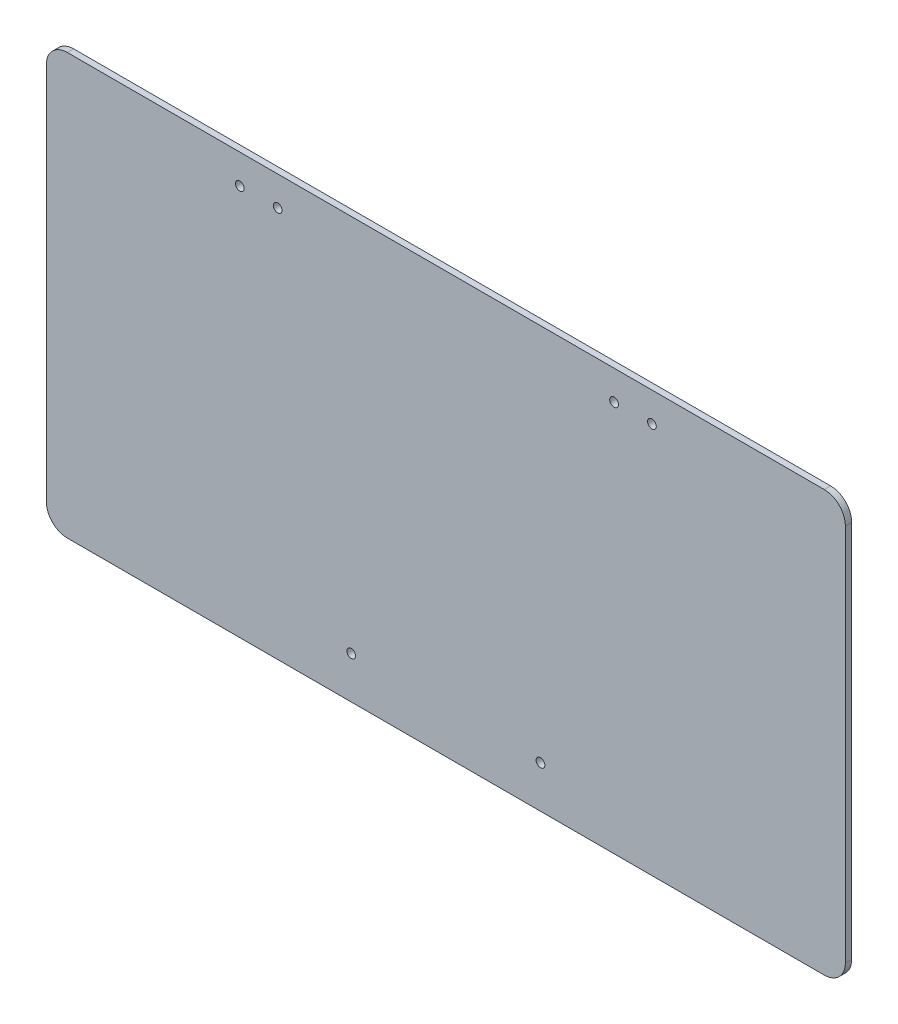
ISO-10303-21;
HEADER;
FILE_DESCRIPTION(('STEP AP214'),'2;1');
FILE_NAME('part.step','',(''),(''),'','','');
FILE_SCHEMA(('AUTOMOTIVE_DESIGN { 1 0 10303 214 1 1 1 1 }'));
ENDSEC;
DATA;
#1=APPLICATION_CONTEXT('core data for automotive mechanical design processes');
#2=APPLICATION_PROTOCOL_DEFINITION('international standard','automotive_design',2000,#1);
#3=PRODUCT_CONTEXT('',#1,'mechanical');
#4=PRODUCT('Part','Part','',(#3));
#5=PRODUCT_RELATED_PRODUCT_CATEGORY('part','',(#4));
#6=PRODUCT_DEFINITION_FORMATION('','',#4);
#7=PRODUCT_DEFINITION_CONTEXT('part definition',#1,'design');
#8=PRODUCT_DEFINITION('design','',#6,#7);
#9=PRODUCT_DEFINITION_SHAPE('','',#8);
#10=(LENGTH_UNIT() NAMED_UNIT(*) SI_UNIT(.MILLI.,.METRE.));
#11=(NAMED_UNIT(*) PLANE_ANGLE_UNIT() SI_UNIT($,.RADIAN.));
#12=(NAMED_UNIT(*) SI_UNIT($,.STERADIAN.) SOLID_ANGLE_UNIT());
#13=UNCERTAINTY_MEASURE_WITH_UNIT(LENGTH_MEASURE(1.E-05),#10,'distance_accuracy_value','');
#14=(GEOMETRIC_REPRESENTATION_CONTEXT(3) GLOBAL_UNCERTAINTY_ASSIGNED_CONTEXT((#13)) GLOBAL_UNIT_ASSIGNED_CONTEXT((#10,
#11,#12)) REPRESENTATION_CONTEXT('',''));
#15=CARTESIAN_POINT('',(0.,0.,0.));
#16=DIRECTION('',(0.,0.,1.));
#17=DIRECTION('',(1.,0.,0.));
#18=AXIS2_PLACEMENT_3D('',#15,#16,#17);
#19=CARTESIAN_POINT('',(190.,100.,3.));
#20=DIRECTION('',(-1.,0.,0.));
#21=DIRECTION('',(0.,-1.,0.));
#22=AXIS2_PLACEMENT_3D('',#19,#20,#21);
#23=PLANE('',#22);
#24=DIRECTION('',(0.,1.,0.));
#25=VECTOR('',#24,1.);
#26=CARTESIAN_POINT('',(190.,100.,3.));
#27=LINE('',#26,#25);
#28=CARTESIAN_POINT('',(190.,-90.,3.));
#29=VERTEX_POINT('',#28);
#30=CARTESIAN_POINT('',(190.,90.,3.));
#31=VERTEX_POINT('',#30);
#32=EDGE_CURVE('E138',#29,#31,#27,.T.);
#33=ORIENTED_EDGE('',*,*,#32,.F.);
#34=DIRECTION('',(0.,0.,-1.));
#35=VECTOR('',#34,1.);
#36=CARTESIAN_POINT('',(190.,-90.,3.));
#37=LINE('',#36,#35);
#38=CARTESIAN_POINT('',(190.,-90.,0.));
#39=VERTEX_POINT('',#38);
#40=EDGE_CURVE('E123',#29,#39,#37,.T.);
#41=ORIENTED_EDGE('',*,*,#40,.T.);
#42=DIRECTION('',(0.,1.,0.));
#43=VECTOR('',#42,1.);
#44=CARTESIAN_POINT('',(190.,100.,0.));
#45=LINE('',#44,#43);
#46=CARTESIAN_POINT('',(190.,90.,0.));
#47=VERTEX_POINT('',#46);
#48=EDGE_CURVE('E135',#39,#47,#45,.T.);
#49=ORIENTED_EDGE('',*,*,#48,.T.);
#50=DIRECTION('',(0.,0.,-1.));
#51=VECTOR('',#50,1.);
#52=CARTESIAN_POINT('',(190.,90.,3.));
#53=LINE('',#52,#51);
#54=EDGE_CURVE('E137',#47,#31,#53,.F.);
#55=ORIENTED_EDGE('',*,*,#54,.T.);
#56=EDGE_LOOP('',(#33,#41,#49,#55));
#57=FACE_BOUND('',#56,.T.);
#58=ADVANCED_FACE('F48',(#57),#23,.F.);
#59=CARTESIAN_POINT('',(-190.,100.,3.));
#60=DIRECTION('',(0.,-1.,0.));
#61=DIRECTION('',(0.,0.,-1.));
#62=AXIS2_PLACEMENT_3D('',#59,#60,#61);
#63=PLANE('',#62);
#64=DIRECTION('',(-1.,0.,0.));
#65=VECTOR('',#64,1.);
#66=CARTESIAN_POINT('',(-190.,100.,3.));
#67=LINE('',#66,#65);
#68=CARTESIAN_POINT('',(180.,100.,3.));
#69=VERTEX_POINT('',#68);
#70=CARTESIAN_POINT('',(-180.,100.,3.));
#71=VERTEX_POINT('',#70);
#72=EDGE_CURVE('E180',#69,#71,#67,.T.);
#73=ORIENTED_EDGE('',*,*,#72,.F.);
#74=DIRECTION('',(0.,0.,-1.));
#75=VECTOR('',#74,1.);
#76=CARTESIAN_POINT('',(180.,100.,3.));
#77=LINE('',#76,#75);
#78=CARTESIAN_POINT('',(180.,100.,0.));
#79=VERTEX_POINT('',#78);
#80=EDGE_CURVE('E12',#69,#79,#77,.T.);
#81=ORIENTED_EDGE('',*,*,#80,.T.);
#82=DIRECTION('',(-1.,0.,0.));
#83=VECTOR('',#82,1.);
#84=CARTESIAN_POINT('',(-190.,100.,0.));
#85=LINE('',#84,#83);
#86=CARTESIAN_POINT('',(-180.,100.,0.));
#87=VERTEX_POINT('',#86);
#88=EDGE_CURVE('E141',#79,#87,#85,.T.);
#89=ORIENTED_EDGE('',*,*,#88,.T.);
#90=DIRECTION('',(0.,0.,-1.));
#91=VECTOR('',#90,1.);
#92=CARTESIAN_POINT('',(-180.,100.,3.));
#93=LINE('',#92,#91);
#94=EDGE_CURVE('E60',#87,#71,#93,.F.);
#95=ORIENTED_EDGE('',*,*,#94,.T.);
#96=EDGE_LOOP('',(#73,#81,#89,#95));
#97=FACE_BOUND('',#96,.T.);
#98=ADVANCED_FACE('F275',(#97),#63,.F.);
#99=CARTESIAN_POINT('',(-190.,100.,3.));
#100=DIRECTION('',(1.,0.,0.));
#101=DIRECTION('',(0.,0.,-1.));
#102=AXIS2_PLACEMENT_3D('',#99,#100,#101);
#103=PLANE('',#102);
#104=DIRECTION('',(0.,-1.,0.));
#105=VECTOR('',#104,1.);
#106=CARTESIAN_POINT('',(-190.,100.,0.));
#107=LINE('',#106,#105);
#108=CARTESIAN_POINT('',(-190.,90.,0.));
#109=VERTEX_POINT('',#108);
#110=CARTESIAN_POINT('',(-190.,-90.,0.));
#111=VERTEX_POINT('',#110);
#112=EDGE_CURVE('E150',#109,#111,#107,.T.);
#113=ORIENTED_EDGE('',*,*,#112,.T.);
#114=DIRECTION('',(0.,0.,-1.));
#115=VECTOR('',#114,1.);
#116=CARTESIAN_POINT('',(-190.,-90.,3.));
#117=LINE('',#116,#115);
#118=CARTESIAN_POINT('',(-190.,-90.,3.));
#119=VERTEX_POINT('',#118);
#120=EDGE_CURVE('E63',#111,#119,#117,.F.);
#121=ORIENTED_EDGE('',*,*,#120,.T.);
#122=DIRECTION('',(0.,-1.,0.));
#123=VECTOR('',#122,1.);
#124=CARTESIAN_POINT('',(-190.,100.,3.));
#125=LINE('',#124,#123);
#126=CARTESIAN_POINT('',(-190.,90.,3.));
#127=VERTEX_POINT('',#126);
#128=EDGE_CURVE('E178',#127,#119,#125,.T.);
#129=ORIENTED_EDGE('',*,*,#128,.F.);
#130=DIRECTION('',(0.,0.,-1.));
#131=VECTOR('',#130,1.);
#132=CARTESIAN_POINT('',(-190.,90.,3.));
#133=LINE('',#132,#131);
#134=EDGE_CURVE('E197',#127,#109,#133,.T.);
#135=ORIENTED_EDGE('',*,*,#134,.T.);
#136=EDGE_LOOP('',(#113,#121,#129,#135));
#137=FACE_BOUND('',#136,.T.);
#138=ADVANCED_FACE('F277',(#137),#103,.F.);
#139=CARTESIAN_POINT('',(-190.,-100.,3.));
#140=DIRECTION('',(0.,1.,0.));
#141=DIRECTION('',(0.,0.,1.));
#142=AXIS2_PLACEMENT_3D('',#139,#140,#141);
#143=PLANE('',#142);
#144=DIRECTION('',(1.,0.,0.));
#145=VECTOR('',#144,1.);
#146=CARTESIAN_POINT('',(-190.,-100.,0.));
#147=LINE('',#146,#145);
#148=CARTESIAN_POINT('',(-180.,-100.,0.));
#149=VERTEX_POINT('',#148);
#150=CARTESIAN_POINT('',(180.,-100.,0.));
#151=VERTEX_POINT('',#150);
#152=EDGE_CURVE('E158',#149,#151,#147,.T.);
#153=ORIENTED_EDGE('',*,*,#152,.T.);
#154=DIRECTION('',(0.,0.,-1.));
#155=VECTOR('',#154,1.);
#156=CARTESIAN_POINT('',(180.,-100.,3.));
#157=LINE('',#156,#155);
#158=CARTESIAN_POINT('',(180.,-100.,3.));
#159=VERTEX_POINT('',#158);
#160=EDGE_CURVE('E124',#151,#159,#157,.F.);
#161=ORIENTED_EDGE('',*,*,#160,.T.);
#162=DIRECTION('',(1.,0.,0.));
#163=VECTOR('',#162,1.);
#164=CARTESIAN_POINT('',(-190.,-100.,3.));
#165=LINE('',#164,#163);
#166=CARTESIAN_POINT('',(-180.,-100.,3.));
#167=VERTEX_POINT('',#166);
#168=EDGE_CURVE('E153',#167,#159,#165,.T.);
#169=ORIENTED_EDGE('',*,*,#168,.F.);
#170=DIRECTION('',(0.,0.,-1.));
#171=VECTOR('',#170,1.);
#172=CARTESIAN_POINT('',(-180.,-100.,3.));
#173=LINE('',#172,#171);
#174=EDGE_CURVE('E130',#167,#149,#173,.T.);
#175=ORIENTED_EDGE('',*,*,#174,.T.);
#176=EDGE_LOOP('',(#153,#161,#169,#175));
#177=FACE_BOUND('',#176,.T.);
#178=ADVANCED_FACE('F301',(#177),#143,.F.);
#179=CARTESIAN_POINT('',(0.,0.,3.));
#180=DIRECTION('',(0.,0.,1.));
#181=DIRECTION('',(1.,0.,0.));
#182=AXIS2_PLACEMENT_3D('',#179,#180,#181);
#183=PLANE('',#182);
#184=CARTESIAN_POINT('',(-45.,-80.,3.));
#185=DIRECTION('',(0.,0.,1.));
#186=DIRECTION('',(1.,0.,0.));
#187=AXIS2_PLACEMENT_3D('',#184,#185,#186);
#188=CIRCLE('',#187,2.075);
#189=CARTESIAN_POINT('',(-42.925,-80.,3.));
#190=VERTEX_POINT('',#189);
#191=EDGE_CURVE('E202',#190,#190,#188,.T.);
#192=ORIENTED_EDGE('',*,*,#191,.F.);
#193=EDGE_LOOP('',(#192));
#194=FACE_BOUND('',#193,.T.);
#195=CARTESIAN_POINT('',(45.,-80.,3.));
#196=DIRECTION('',(0.,0.,1.));
#197=DIRECTION('',(1.,0.,0.));
#198=AXIS2_PLACEMENT_3D('',#195,#196,#197);
#199=CIRCLE('',#198,2.075);
#200=CARTESIAN_POINT('',(47.075,-80.,3.));
#201=VERTEX_POINT('',#200);
#202=EDGE_CURVE('E211',#201,#201,#199,.T.);
#203=ORIENTED_EDGE('',*,*,#202,.F.);
#204=EDGE_LOOP('',(#203));
#205=FACE_BOUND('',#204,.T.);
#206=CARTESIAN_POINT('',(-98.,86.,3.));
#207=DIRECTION('',(0.,0.,1.));
#208=DIRECTION('',(1.,0.,0.));
#209=AXIS2_PLACEMENT_3D('',#206,#207,#208);
#210=CIRCLE('',#209,2.07499999999999);
#211=CARTESIAN_POINT('',(-95.925,86.,3.));
#212=VERTEX_POINT('',#211);
#213=EDGE_CURVE('E147',#212,#212,#210,.T.);
#214=ORIENTED_EDGE('',*,*,#213,.F.);
#215=EDGE_LOOP('',(#214));
#216=FACE_BOUND('',#215,.T.);
#217=CARTESIAN_POINT('',(-80.,86.,3.));
#218=DIRECTION('',(0.,0.,1.));
#219=DIRECTION('',(1.,0.,0.));
#220=AXIS2_PLACEMENT_3D('',#217,#218,#219);
#221=CIRCLE('',#220,2.07499999999999);
#222=CARTESIAN_POINT('',(-77.925,86.,3.));
#223=VERTEX_POINT('',#222);
#224=EDGE_CURVE('E228',#223,#223,#221,.T.);
#225=ORIENTED_EDGE('',*,*,#224,.F.);
#226=EDGE_LOOP('',(#225));
#227=FACE_BOUND('',#226,.T.);
#228=CARTESIAN_POINT('',(80.,86.,3.));
#229=DIRECTION('',(0.,0.,1.));
#230=DIRECTION('',(-1.,0.,0.));
#231=AXIS2_PLACEMENT_3D('',#228,#229,#230);
#232=CIRCLE('',#231,2.07499999999999);
#233=CARTESIAN_POINT('',(77.925,86.,3.));
#234=VERTEX_POINT('',#233);
#235=EDGE_CURVE('E236',#234,#234,#232,.T.);
#236=ORIENTED_EDGE('',*,*,#235,.F.);
#237=EDGE_LOOP('',(#236));
#238=FACE_BOUND('',#237,.T.);
#239=CARTESIAN_POINT('',(98.,86.,3.));
#240=DIRECTION('',(0.,0.,1.));
#241=DIRECTION('',(-1.,0.,0.));
#242=AXIS2_PLACEMENT_3D('',#239,#240,#241);
#243=CIRCLE('',#242,2.07499999999999);
#244=CARTESIAN_POINT('',(95.925,86.,3.));
#245=VERTEX_POINT('',#244);
#246=EDGE_CURVE('E241',#245,#245,#243,.T.);
#247=ORIENTED_EDGE('',*,*,#246,.F.);
#248=EDGE_LOOP('',(#247));
#249=FACE_BOUND('',#248,.T.);
#250=ORIENTED_EDGE('',*,*,#168,.T.);
#251=CARTESIAN_POINT('',(180.,-90.,3.));
#252=DIRECTION('',(0.,0.,1.));
#253=DIRECTION('',(1.,0.,0.));
#254=AXIS2_PLACEMENT_3D('',#251,#252,#253);
#255=CIRCLE('',#254,10.);
#256=EDGE_CURVE('E192',#159,#29,#255,.T.);
#257=ORIENTED_EDGE('',*,*,#256,.T.);
#258=ORIENTED_EDGE('',*,*,#32,.T.);
#259=CARTESIAN_POINT('',(180.,90.,3.));
#260=DIRECTION('',(0.,0.,1.));
#261=DIRECTION('',(1.,0.,0.));
#262=AXIS2_PLACEMENT_3D('',#259,#260,#261);
#263=CIRCLE('',#262,10.);
#264=EDGE_CURVE('E168',#31,#69,#263,.T.);
#265=ORIENTED_EDGE('',*,*,#264,.T.);
#266=ORIENTED_EDGE('',*,*,#72,.T.);
#267=CARTESIAN_POINT('',(-180.,90.,3.));
#268=DIRECTION('',(0.,0.,1.));
#269=DIRECTION('',(1.,0.,0.));
#270=AXIS2_PLACEMENT_3D('',#267,#268,#269);
#271=CIRCLE('',#270,10.);
#272=EDGE_CURVE('E75',#71,#127,#271,.T.);
#273=ORIENTED_EDGE('',*,*,#272,.T.);
#274=ORIENTED_EDGE('',*,*,#128,.T.);
#275=CARTESIAN_POINT('',(-180.,-90.,3.));
#276=DIRECTION('',(0.,0.,1.));
#277=DIRECTION('',(1.,0.,0.));
#278=AXIS2_PLACEMENT_3D('',#275,#276,#277);
#279=CIRCLE('',#278,10.);
#280=EDGE_CURVE('E196',#119,#167,#279,.T.);
#281=ORIENTED_EDGE('',*,*,#280,.T.);
#282=EDGE_LOOP('',(#250,#257,#258,#265,#266,#273,#274,#281));
#283=FACE_BOUND('',#282,.T.);
#284=ADVANCED_FACE('F270',(#194,#205,#216,#227,#238,#249,#283),#183,.T.);
#285=CARTESIAN_POINT('',(0.,0.,0.));
#286=DIRECTION('',(0.,0.,1.));
#287=DIRECTION('',(1.,0.,0.));
#288=AXIS2_PLACEMENT_3D('',#285,#286,#287);
#289=PLANE('',#288);
#290=CARTESIAN_POINT('',(-45.,-80.,0.));
#291=DIRECTION('',(0.,0.,1.));
#292=DIRECTION('',(1.,0.,0.));
#293=AXIS2_PLACEMENT_3D('',#290,#291,#292);
#294=CIRCLE('',#293,2.075);
#295=CARTESIAN_POINT('',(-42.925,-80.,0.));
#296=VERTEX_POINT('',#295);
#297=EDGE_CURVE('E55',#296,#296,#294,.T.);
#298=ORIENTED_EDGE('',*,*,#297,.T.);
#299=EDGE_LOOP('',(#298));
#300=FACE_BOUND('',#299,.T.);
#301=CARTESIAN_POINT('',(45.,-80.,0.));
#302=DIRECTION('',(0.,0.,1.));
#303=DIRECTION('',(1.,0.,0.));
#304=AXIS2_PLACEMENT_3D('',#301,#302,#303);
#305=CIRCLE('',#304,2.075);
#306=CARTESIAN_POINT('',(47.075,-80.,0.));
#307=VERTEX_POINT('',#306);
#308=EDGE_CURVE('E201',#307,#307,#305,.T.);
#309=ORIENTED_EDGE('',*,*,#308,.T.);
#310=EDGE_LOOP('',(#309));
#311=FACE_BOUND('',#310,.T.);
#312=CARTESIAN_POINT('',(-98.,86.,0.));
#313=DIRECTION('',(0.,0.,1.));
#314=DIRECTION('',(1.,0.,0.));
#315=AXIS2_PLACEMENT_3D('',#312,#313,#314);
#316=CIRCLE('',#315,2.07499999999999);
#317=CARTESIAN_POINT('',(-95.925,86.,0.));
#318=VERTEX_POINT('',#317);
#319=EDGE_CURVE('E145',#318,#318,#316,.T.);
#320=ORIENTED_EDGE('',*,*,#319,.T.);
#321=EDGE_LOOP('',(#320));
#322=FACE_BOUND('',#321,.T.);
#323=CARTESIAN_POINT('',(-80.,86.,0.));
#324=DIRECTION('',(0.,0.,1.));
#325=DIRECTION('',(1.,0.,0.));
#326=AXIS2_PLACEMENT_3D('',#323,#324,#325);
#327=CIRCLE('',#326,2.07499999999999);
#328=CARTESIAN_POINT('',(-77.925,86.,0.));
#329=VERTEX_POINT('',#328);
#330=EDGE_CURVE('E231',#329,#329,#327,.T.);
#331=ORIENTED_EDGE('',*,*,#330,.T.);
#332=EDGE_LOOP('',(#331));
#333=FACE_BOUND('',#332,.T.);
#334=CARTESIAN_POINT('',(80.,86.,0.));
#335=DIRECTION('',(0.,0.,1.));
#336=DIRECTION('',(-1.,0.,0.));
#337=AXIS2_PLACEMENT_3D('',#334,#335,#336);
#338=CIRCLE('',#337,2.07499999999999);
#339=CARTESIAN_POINT('',(77.925,86.,0.));
#340=VERTEX_POINT('',#339);
#341=EDGE_CURVE('E245',#340,#340,#338,.T.);
#342=ORIENTED_EDGE('',*,*,#341,.T.);
#343=EDGE_LOOP('',(#342));
#344=FACE_BOUND('',#343,.T.);
#345=CARTESIAN_POINT('',(98.,86.,0.));
#346=DIRECTION('',(0.,0.,1.));
#347=DIRECTION('',(-1.,0.,0.));
#348=AXIS2_PLACEMENT_3D('',#345,#346,#347);
#349=CIRCLE('',#348,2.07499999999999);
#350=CARTESIAN_POINT('',(95.925,86.,0.));
#351=VERTEX_POINT('',#350);
#352=EDGE_CURVE('E187',#351,#351,#349,.T.);
#353=ORIENTED_EDGE('',*,*,#352,.T.);
#354=EDGE_LOOP('',(#353));
#355=FACE_BOUND('',#354,.T.);
#356=ORIENTED_EDGE('',*,*,#48,.F.);
#357=CARTESIAN_POINT('',(180.,-90.,0.));
#358=DIRECTION('',(0.,0.,1.));
#359=DIRECTION('',(1.,0.,0.));
#360=AXIS2_PLACEMENT_3D('',#357,#358,#359);
#361=CIRCLE('',#360,10.);
#362=EDGE_CURVE('E119',#39,#151,#361,.F.);
#363=ORIENTED_EDGE('',*,*,#362,.T.);
#364=ORIENTED_EDGE('',*,*,#152,.F.);
#365=CARTESIAN_POINT('',(-180.,-90.,0.));
#366=DIRECTION('',(0.,0.,1.));
#367=DIRECTION('',(1.,0.,0.));
#368=AXIS2_PLACEMENT_3D('',#365,#366,#367);
#369=CIRCLE('',#368,10.);
#370=EDGE_CURVE('E126',#149,#111,#369,.F.);
#371=ORIENTED_EDGE('',*,*,#370,.T.);
#372=ORIENTED_EDGE('',*,*,#112,.F.);
#373=CARTESIAN_POINT('',(-180.,90.,0.));
#374=DIRECTION('',(0.,0.,1.));
#375=DIRECTION('',(1.,0.,0.));
#376=AXIS2_PLACEMENT_3D('',#373,#374,#375);
#377=CIRCLE('',#376,10.);
#378=EDGE_CURVE('E139',#109,#87,#377,.F.);
#379=ORIENTED_EDGE('',*,*,#378,.T.);
#380=ORIENTED_EDGE('',*,*,#88,.F.);
#381=CARTESIAN_POINT('',(180.,90.,0.));
#382=DIRECTION('',(0.,0.,1.));
#383=DIRECTION('',(1.,0.,0.));
#384=AXIS2_PLACEMENT_3D('',#381,#382,#383);
#385=CIRCLE('',#384,10.);
#386=EDGE_CURVE('E142',#79,#47,#385,.F.);
#387=ORIENTED_EDGE('',*,*,#386,.T.);
#388=EDGE_LOOP('',(#356,#363,#364,#371,#372,#379,#380,#387));
#389=FACE_BOUND('',#388,.T.);
#390=ADVANCED_FACE('F136',(#300,#311,#322,#333,#344,#355,#389),#289,.F.);
#391=CARTESIAN_POINT('',(98.,86.,0.));
#392=DIRECTION('',(0.,0.,1.));
#393=DIRECTION('',(1.,0.,0.));
#394=AXIS2_PLACEMENT_3D('',#391,#392,#393);
#395=CYLINDRICAL_SURFACE('',#394,2.07499999999999);
#396=ORIENTED_EDGE('',*,*,#352,.F.);
#397=EDGE_LOOP('',(#396));
#398=FACE_BOUND('',#397,.T.);
#399=ORIENTED_EDGE('',*,*,#246,.T.);
#400=EDGE_LOOP('',(#399));
#401=FACE_BOUND('',#400,.T.);
#402=ADVANCED_FACE('F258',(#398,#401),#395,.F.);
#403=CARTESIAN_POINT('',(80.,86.,0.));
#404=DIRECTION('',(0.,0.,1.));
#405=DIRECTION('',(1.,0.,0.));
#406=AXIS2_PLACEMENT_3D('',#403,#404,#405);
#407=CYLINDRICAL_SURFACE('',#406,2.07499999999999);
#408=ORIENTED_EDGE('',*,*,#341,.F.);
#409=EDGE_LOOP('',(#408));
#410=FACE_BOUND('',#409,.T.);
#411=ORIENTED_EDGE('',*,*,#235,.T.);
#412=EDGE_LOOP('',(#411));
#413=FACE_BOUND('',#412,.T.);
#414=ADVANCED_FACE('F256',(#410,#413),#407,.F.);
#415=CARTESIAN_POINT('',(-80.,86.,0.));
#416=DIRECTION('',(0.,0.,1.));
#417=DIRECTION('',(1.,0.,0.));
#418=AXIS2_PLACEMENT_3D('',#415,#416,#417);
#419=CYLINDRICAL_SURFACE('',#418,2.07499999999999);
#420=ORIENTED_EDGE('',*,*,#330,.F.);
#421=EDGE_LOOP('',(#420));
#422=FACE_BOUND('',#421,.T.);
#423=ORIENTED_EDGE('',*,*,#224,.T.);
#424=EDGE_LOOP('',(#423));
#425=FACE_BOUND('',#424,.T.);
#426=ADVANCED_FACE('F263',(#422,#425),#419,.F.);
#427=CARTESIAN_POINT('',(-98.,86.,0.));
#428=DIRECTION('',(0.,0.,1.));
#429=DIRECTION('',(1.,0.,0.));
#430=AXIS2_PLACEMENT_3D('',#427,#428,#429);
#431=CYLINDRICAL_SURFACE('',#430,2.07499999999999);
#432=ORIENTED_EDGE('',*,*,#319,.F.);
#433=EDGE_LOOP('',(#432));
#434=FACE_BOUND('',#433,.T.);
#435=ORIENTED_EDGE('',*,*,#213,.T.);
#436=EDGE_LOOP('',(#435));
#437=FACE_BOUND('',#436,.T.);
#438=ADVANCED_FACE('F281',(#434,#437),#431,.F.);
#439=CARTESIAN_POINT('',(180.,-90.,3.));
#440=DIRECTION('',(0.,0.,-1.));
#441=DIRECTION('',(-1.,0.,0.));
#442=AXIS2_PLACEMENT_3D('',#439,#440,#441);
#443=CYLINDRICAL_SURFACE('',#442,10.);
#444=ORIENTED_EDGE('',*,*,#256,.F.);
#445=ORIENTED_EDGE('',*,*,#160,.F.);
#446=ORIENTED_EDGE('',*,*,#362,.F.);
#447=ORIENTED_EDGE('',*,*,#40,.F.);
#448=EDGE_LOOP('',(#444,#445,#446,#447));
#449=FACE_BOUND('',#448,.T.);
#450=ADVANCED_FACE('F118',(#449),#443,.T.);
#451=CARTESIAN_POINT('',(-180.,-90.,3.));
#452=DIRECTION('',(0.,0.,-1.));
#453=DIRECTION('',(-1.,0.,0.));
#454=AXIS2_PLACEMENT_3D('',#451,#452,#453);
#455=CYLINDRICAL_SURFACE('',#454,10.);
#456=ORIENTED_EDGE('',*,*,#280,.F.);
#457=ORIENTED_EDGE('',*,*,#120,.F.);
#458=ORIENTED_EDGE('',*,*,#370,.F.);
#459=ORIENTED_EDGE('',*,*,#174,.F.);
#460=EDGE_LOOP('',(#456,#457,#458,#459));
#461=FACE_BOUND('',#460,.T.);
#462=ADVANCED_FACE('F285',(#461),#455,.T.);
#463=CARTESIAN_POINT('',(180.,90.,3.));
#464=DIRECTION('',(0.,0.,-1.));
#465=DIRECTION('',(-1.,0.,0.));
#466=AXIS2_PLACEMENT_3D('',#463,#464,#465);
#467=CYLINDRICAL_SURFACE('',#466,10.);
#468=ORIENTED_EDGE('',*,*,#264,.F.);
#469=ORIENTED_EDGE('',*,*,#54,.F.);
#470=ORIENTED_EDGE('',*,*,#386,.F.);
#471=ORIENTED_EDGE('',*,*,#80,.F.);
#472=EDGE_LOOP('',(#468,#469,#470,#471));
#473=FACE_BOUND('',#472,.T.);
#474=ADVANCED_FACE('F288',(#473),#467,.T.);
#475=CARTESIAN_POINT('',(-180.,90.,3.));
#476=DIRECTION('',(0.,0.,-1.));
#477=DIRECTION('',(-1.,0.,0.));
#478=AXIS2_PLACEMENT_3D('',#475,#476,#477);
#479=CYLINDRICAL_SURFACE('',#478,10.);
#480=ORIENTED_EDGE('',*,*,#272,.F.);
#481=ORIENTED_EDGE('',*,*,#94,.F.);
#482=ORIENTED_EDGE('',*,*,#378,.F.);
#483=ORIENTED_EDGE('',*,*,#134,.F.);
#484=EDGE_LOOP('',(#480,#481,#482,#483));
#485=FACE_BOUND('',#484,.T.);
#486=ADVANCED_FACE('F49',(#485),#479,.T.);
#487=CARTESIAN_POINT('',(45.,-80.,-2.));
#488=DIRECTION('',(0.,0.,1.));
#489=DIRECTION('',(1.,0.,0.));
#490=AXIS2_PLACEMENT_3D('',#487,#488,#489);
#491=CYLINDRICAL_SURFACE('',#490,2.075);
#492=ORIENTED_EDGE('',*,*,#202,.T.);
#493=EDGE_LOOP('',(#492));
#494=FACE_BOUND('',#493,.T.);
#495=ORIENTED_EDGE('',*,*,#308,.F.);
#496=EDGE_LOOP('',(#495));
#497=FACE_BOUND('',#496,.T.);
#498=ADVANCED_FACE('F291',(#494,#497),#491,.F.);
#499=CARTESIAN_POINT('',(-45.,-80.,-2.));
#500=DIRECTION('',(0.,0.,1.));
#501=DIRECTION('',(1.,0.,0.));
#502=AXIS2_PLACEMENT_3D('',#499,#500,#501);
#503=CYLINDRICAL_SURFACE('',#502,2.075);
#504=ORIENTED_EDGE('',*,*,#191,.T.);
#505=EDGE_LOOP('',(#504));
#506=FACE_BOUND('',#505,.T.);
#507=ORIENTED_EDGE('',*,*,#297,.F.);
#508=EDGE_LOOP('',(#507));
#509=FACE_BOUND('',#508,.T.);
#510=ADVANCED_FACE('F336',(#506,#509),#503,.F.);
#511=CLOSED_SHELL('',(#58,#98,#138,#178,#284,#390,#402,#414,#426,#438,#450,#462,#474,#486,#498,#510));
#512=MANIFOLD_SOLID_BREP('B2',#511);
#513=ADVANCED_BREP_SHAPE_REPRESENTATION('',(#18,#512),#14);
#514=SHAPE_DEFINITION_REPRESENTATION(#9,#513);
ENDSEC;
END-ISO-10303-21;
